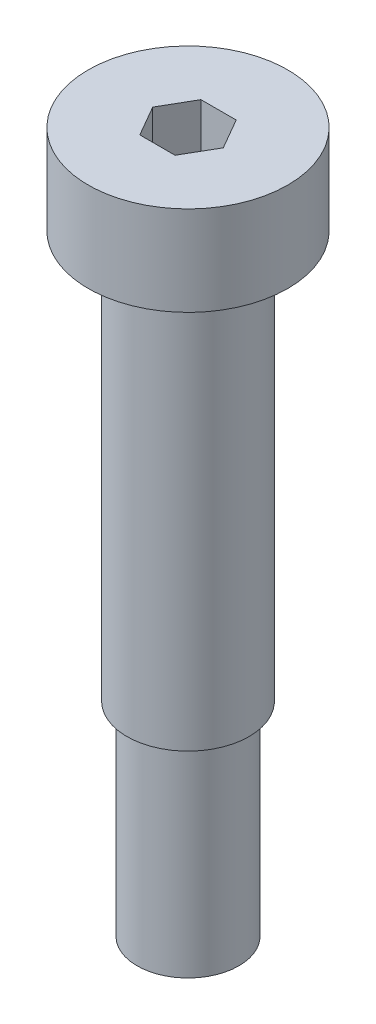
ISO-10303-21;
HEADER;
FILE_DESCRIPTION(('STEP AP214'),'2;1');
FILE_NAME('part.step','',(''),(''),'','','');
FILE_SCHEMA(('AUTOMOTIVE_DESIGN { 1 0 10303 214 1 1 1 1 }'));
ENDSEC;
DATA;
#1=APPLICATION_CONTEXT('core data for automotive mechanical design processes');
#2=APPLICATION_PROTOCOL_DEFINITION('international standard','automotive_design',2000,#1);
#3=PRODUCT_CONTEXT('',#1,'mechanical');
#4=PRODUCT('Part','Part','',(#3));
#5=PRODUCT_RELATED_PRODUCT_CATEGORY('part','',(#4));
#6=PRODUCT_DEFINITION_FORMATION('','',#4);
#7=PRODUCT_DEFINITION_CONTEXT('part definition',#1,'design');
#8=PRODUCT_DEFINITION('design','',#6,#7);
#9=PRODUCT_DEFINITION_SHAPE('','',#8);
#10=(LENGTH_UNIT() NAMED_UNIT(*) SI_UNIT(.MILLI.,.METRE.));
#11=(NAMED_UNIT(*) PLANE_ANGLE_UNIT() SI_UNIT($,.RADIAN.));
#12=(NAMED_UNIT(*) SI_UNIT($,.STERADIAN.) SOLID_ANGLE_UNIT());
#13=UNCERTAINTY_MEASURE_WITH_UNIT(LENGTH_MEASURE(1.E-05),#10,'distance_accuracy_value','');
#14=(GEOMETRIC_REPRESENTATION_CONTEXT(3) GLOBAL_UNCERTAINTY_ASSIGNED_CONTEXT((#13)) GLOBAL_UNIT_ASSIGNED_CONTEXT((#10,
#11,#12)) REPRESENTATION_CONTEXT('',''));
#15=CARTESIAN_POINT('',(0.,0.,0.));
#16=DIRECTION('',(0.,0.,1.));
#17=DIRECTION('',(1.,0.,0.));
#18=AXIS2_PLACEMENT_3D('',#15,#16,#17);
#19=CARTESIAN_POINT('',(2.5,0.,0.));
#20=DIRECTION('',(0.,-1.,0.));
#21=DIRECTION('',(1.,0.,0.));
#22=AXIS2_PLACEMENT_3D('',#19,#20,#21);
#23=PLANE('',#22);
#24=CARTESIAN_POINT('',(0.,0.,0.));
#25=DIRECTION('',(0.,-1.,0.));
#26=DIRECTION('',(1.,0.,0.));
#27=AXIS2_PLACEMENT_3D('',#24,#25,#26);
#28=CIRCLE('',#27,2.5);
#29=CARTESIAN_POINT('',(2.5,0.,0.));
#30=VERTEX_POINT('',#29);
#31=EDGE_CURVE('E157',#30,#30,#28,.T.);
#32=ORIENTED_EDGE('',*,*,#31,.T.);
#33=EDGE_LOOP('',(#32));
#34=FACE_BOUND('',#33,.T.);
#35=ADVANCED_FACE('F43',(#34),#23,.T.);
#36=CARTESIAN_POINT('',(0.,34.4,0.));
#37=DIRECTION('',(0.,1.,0.));
#38=DIRECTION('',(-1.,0.,0.));
#39=AXIS2_PLACEMENT_3D('',#36,#37,#38);
#40=PLANE('',#39);
#41=DIRECTION('',(0.5,0.,-0.866025403784439));
#42=VECTOR('',#41,1.);
#43=CARTESIAN_POINT('',(0.86602540378444,34.4,1.5));
#44=LINE('',#43,#42);
#45=CARTESIAN_POINT('',(0.86602540378444,34.4,1.5));
#46=VERTEX_POINT('',#45);
#47=CARTESIAN_POINT('',(1.73205080756888,34.4,0.));
#48=VERTEX_POINT('',#47);
#49=EDGE_CURVE('E58',#46,#48,#44,.T.);
#50=ORIENTED_EDGE('',*,*,#49,.F.);
#51=DIRECTION('',(1.,0.,0.));
#52=VECTOR('',#51,1.);
#53=CARTESIAN_POINT('',(-0.866025403784439,34.4,1.5));
#54=LINE('',#53,#52);
#55=CARTESIAN_POINT('',(-0.866025403784439,34.4,1.5));
#56=VERTEX_POINT('',#55);
#57=EDGE_CURVE('E151',#56,#46,#54,.T.);
#58=ORIENTED_EDGE('',*,*,#57,.F.);
#59=DIRECTION('',(0.5,0.,0.866025403784438));
#60=VECTOR('',#59,1.);
#61=CARTESIAN_POINT('',(-1.73205080756888,34.4,0.));
#62=LINE('',#61,#60);
#63=CARTESIAN_POINT('',(-1.73205080756888,34.4,0.));
#64=VERTEX_POINT('',#63);
#65=EDGE_CURVE('E148',#64,#56,#62,.T.);
#66=ORIENTED_EDGE('',*,*,#65,.F.);
#67=DIRECTION('',(-0.5,0.,0.866025403784438));
#68=VECTOR('',#67,1.);
#69=CARTESIAN_POINT('',(-0.866025403784439,34.4,-1.5));
#70=LINE('',#69,#68);
#71=CARTESIAN_POINT('',(-0.866025403784439,34.4,-1.5));
#72=VERTEX_POINT('',#71);
#73=EDGE_CURVE('E106',#72,#64,#70,.T.);
#74=ORIENTED_EDGE('',*,*,#73,.F.);
#75=DIRECTION('',(-1.,0.,0.));
#76=VECTOR('',#75,1.);
#77=CARTESIAN_POINT('',(0.866025403784437,34.4,-1.5));
#78=LINE('',#77,#76);
#79=CARTESIAN_POINT('',(0.866025403784437,34.4,-1.5));
#80=VERTEX_POINT('',#79);
#81=EDGE_CURVE('E142',#80,#72,#78,.T.);
#82=ORIENTED_EDGE('',*,*,#81,.F.);
#83=DIRECTION('',(-0.5,0.,-0.866025403784439));
#84=VECTOR('',#83,1.);
#85=CARTESIAN_POINT('',(1.73205080756888,34.4,0.));
#86=LINE('',#85,#84);
#87=EDGE_CURVE('E138',#48,#80,#86,.T.);
#88=ORIENTED_EDGE('',*,*,#87,.F.);
#89=EDGE_LOOP('',(#50,#58,#66,#74,#82,#88));
#90=FACE_BOUND('',#89,.T.);
#91=CARTESIAN_POINT('',(0.,34.4,0.));
#92=DIRECTION('',(0.,-1.,0.));
#93=DIRECTION('',(1.,0.,0.));
#94=AXIS2_PLACEMENT_3D('',#91,#92,#93);
#95=CIRCLE('',#94,4.9);
#96=CARTESIAN_POINT('',(4.9,34.4,0.));
#97=VERTEX_POINT('',#96);
#98=EDGE_CURVE('E11',#97,#97,#95,.T.);
#99=ORIENTED_EDGE('',*,*,#98,.F.);
#100=EDGE_LOOP('',(#99));
#101=FACE_BOUND('',#100,.T.);
#102=ADVANCED_FACE('F190',(#90,#101),#40,.T.);
#103=CARTESIAN_POINT('',(0.,0.,0.));
#104=DIRECTION('',(0.,-1.,0.));
#105=DIRECTION('',(1.,0.,0.));
#106=AXIS2_PLACEMENT_3D('',#103,#104,#105);
#107=CYLINDRICAL_SURFACE('',#106,4.9);
#108=ORIENTED_EDGE('',*,*,#98,.T.);
#109=EDGE_LOOP('',(#108));
#110=FACE_BOUND('',#109,.T.);
#111=CARTESIAN_POINT('',(0.,30.,0.));
#112=DIRECTION('',(0.,-1.,0.));
#113=DIRECTION('',(1.,0.,0.));
#114=AXIS2_PLACEMENT_3D('',#111,#112,#113);
#115=CIRCLE('',#114,4.9);
#116=CARTESIAN_POINT('',(4.9,30.,0.));
#117=VERTEX_POINT('',#116);
#118=EDGE_CURVE('E51',#117,#117,#115,.T.);
#119=ORIENTED_EDGE('',*,*,#118,.F.);
#120=EDGE_LOOP('',(#119));
#121=FACE_BOUND('',#120,.T.);
#122=ADVANCED_FACE('F188',(#110,#121),#107,.T.);
#123=CARTESIAN_POINT('',(4.9,30.,0.));
#124=DIRECTION('',(0.,-1.,0.));
#125=DIRECTION('',(1.,0.,0.));
#126=AXIS2_PLACEMENT_3D('',#123,#124,#125);
#127=PLANE('',#126);
#128=ORIENTED_EDGE('',*,*,#118,.T.);
#129=EDGE_LOOP('',(#128));
#130=FACE_BOUND('',#129,.T.);
#131=CARTESIAN_POINT('',(0.,30.,0.));
#132=DIRECTION('',(0.,-1.,0.));
#133=DIRECTION('',(1.,0.,0.));
#134=AXIS2_PLACEMENT_3D('',#131,#132,#133);
#135=CIRCLE('',#134,3.);
#136=CARTESIAN_POINT('',(3.,30.,0.));
#137=VERTEX_POINT('',#136);
#138=EDGE_CURVE('E178',#137,#137,#135,.T.);
#139=ORIENTED_EDGE('',*,*,#138,.F.);
#140=EDGE_LOOP('',(#139));
#141=FACE_BOUND('',#140,.T.);
#142=ADVANCED_FACE('F185',(#130,#141),#127,.T.);
#143=CARTESIAN_POINT('',(0.,0.,0.));
#144=DIRECTION('',(0.,-1.,0.));
#145=DIRECTION('',(1.,0.,0.));
#146=AXIS2_PLACEMENT_3D('',#143,#144,#145);
#147=CYLINDRICAL_SURFACE('',#146,3.);
#148=ORIENTED_EDGE('',*,*,#138,.T.);
#149=EDGE_LOOP('',(#148));
#150=FACE_BOUND('',#149,.T.);
#151=CARTESIAN_POINT('',(0.,10.,0.));
#152=DIRECTION('',(0.,-1.,0.));
#153=DIRECTION('',(1.,0.,0.));
#154=AXIS2_PLACEMENT_3D('',#151,#152,#153);
#155=CIRCLE('',#154,3.);
#156=CARTESIAN_POINT('',(3.,10.,0.));
#157=VERTEX_POINT('',#156);
#158=EDGE_CURVE('E174',#157,#157,#155,.T.);
#159=ORIENTED_EDGE('',*,*,#158,.F.);
#160=EDGE_LOOP('',(#159));
#161=FACE_BOUND('',#160,.T.);
#162=ADVANCED_FACE('F197',(#150,#161),#147,.T.);
#163=CARTESIAN_POINT('',(3.,10.,0.));
#164=DIRECTION('',(0.,-1.,0.));
#165=DIRECTION('',(1.,0.,0.));
#166=AXIS2_PLACEMENT_3D('',#163,#164,#165);
#167=PLANE('',#166);
#168=ORIENTED_EDGE('',*,*,#158,.T.);
#169=EDGE_LOOP('',(#168));
#170=FACE_BOUND('',#169,.T.);
#171=CARTESIAN_POINT('',(0.,10.,0.));
#172=DIRECTION('',(0.,-1.,0.));
#173=DIRECTION('',(1.,0.,0.));
#174=AXIS2_PLACEMENT_3D('',#171,#172,#173);
#175=CIRCLE('',#174,2.5);
#176=CARTESIAN_POINT('',(2.5,10.,0.));
#177=VERTEX_POINT('',#176);
#178=EDGE_CURVE('E170',#177,#177,#175,.T.);
#179=ORIENTED_EDGE('',*,*,#178,.F.);
#180=EDGE_LOOP('',(#179));
#181=FACE_BOUND('',#180,.T.);
#182=ADVANCED_FACE('F209',(#170,#181),#167,.T.);
#183=CARTESIAN_POINT('',(0.,0.,0.));
#184=DIRECTION('',(0.,-1.,0.));
#185=DIRECTION('',(1.,0.,0.));
#186=AXIS2_PLACEMENT_3D('',#183,#184,#185);
#187=CYLINDRICAL_SURFACE('',#186,2.5);
#188=ORIENTED_EDGE('',*,*,#178,.T.);
#189=EDGE_LOOP('',(#188));
#190=FACE_BOUND('',#189,.T.);
#191=ORIENTED_EDGE('',*,*,#31,.F.);
#192=EDGE_LOOP('',(#191));
#193=FACE_BOUND('',#192,.T.);
#194=ADVANCED_FACE('F206',(#190,#193),#187,.T.);
#195=CARTESIAN_POINT('',(0.86602540378444,31.4,1.5));
#196=DIRECTION('',(0.866025403784439,0.,0.5));
#197=DIRECTION('',(0.5,0.,-0.866025403784439));
#198=AXIS2_PLACEMENT_3D('',#195,#196,#197);
#199=PLANE('',#198);
#200=ORIENTED_EDGE('',*,*,#49,.T.);
#201=DIRECTION('',(0.,1.,0.));
#202=VECTOR('',#201,1.);
#203=CARTESIAN_POINT('',(1.73205080756888,31.4,0.));
#204=LINE('',#203,#202);
#205=CARTESIAN_POINT('',(1.73205080756888,31.4,0.));
#206=VERTEX_POINT('',#205);
#207=EDGE_CURVE('E88',#206,#48,#204,.T.);
#208=ORIENTED_EDGE('',*,*,#207,.F.);
#209=DIRECTION('',(0.5,0.,-0.866025403784439));
#210=VECTOR('',#209,1.);
#211=CARTESIAN_POINT('',(0.86602540378444,31.4,1.5));
#212=LINE('',#211,#210);
#213=CARTESIAN_POINT('',(0.86602540378444,31.4,1.5));
#214=VERTEX_POINT('',#213);
#215=EDGE_CURVE('E154',#214,#206,#212,.T.);
#216=ORIENTED_EDGE('',*,*,#215,.F.);
#217=DIRECTION('',(0.,1.,0.));
#218=VECTOR('',#217,1.);
#219=CARTESIAN_POINT('',(0.86602540378444,31.4,1.5));
#220=LINE('',#219,#218);
#221=EDGE_CURVE('E66',#214,#46,#220,.T.);
#222=ORIENTED_EDGE('',*,*,#221,.T.);
#223=EDGE_LOOP('',(#200,#208,#216,#222));
#224=FACE_BOUND('',#223,.T.);
#225=ADVANCED_FACE('F208',(#224),#199,.F.);
#226=CARTESIAN_POINT('',(-0.866025403784439,31.4,1.5));
#227=DIRECTION('',(0.,0.,1.));
#228=DIRECTION('',(1.,0.,0.));
#229=AXIS2_PLACEMENT_3D('',#226,#227,#228);
#230=PLANE('',#229);
#231=ORIENTED_EDGE('',*,*,#57,.T.);
#232=ORIENTED_EDGE('',*,*,#221,.F.);
#233=DIRECTION('',(1.,0.,0.));
#234=VECTOR('',#233,1.);
#235=CARTESIAN_POINT('',(-0.866025403784439,31.4,1.5));
#236=LINE('',#235,#234);
#237=CARTESIAN_POINT('',(-0.866025403784439,31.4,1.5));
#238=VERTEX_POINT('',#237);
#239=EDGE_CURVE('E120',#238,#214,#236,.T.);
#240=ORIENTED_EDGE('',*,*,#239,.F.);
#241=DIRECTION('',(0.,1.,0.));
#242=VECTOR('',#241,1.);
#243=CARTESIAN_POINT('',(-0.866025403784439,31.4,1.5));
#244=LINE('',#243,#242);
#245=EDGE_CURVE('E111',#238,#56,#244,.T.);
#246=ORIENTED_EDGE('',*,*,#245,.T.);
#247=EDGE_LOOP('',(#231,#232,#240,#246));
#248=FACE_BOUND('',#247,.T.);
#249=ADVANCED_FACE('F216',(#248),#230,.F.);
#250=CARTESIAN_POINT('',(-1.73205080756888,31.4,0.));
#251=DIRECTION('',(-0.866025403784438,0.,0.500000000000001));
#252=DIRECTION('',(0.500000000000001,0.,0.866025403784438));
#253=AXIS2_PLACEMENT_3D('',#250,#251,#252);
#254=PLANE('',#253);
#255=ORIENTED_EDGE('',*,*,#65,.T.);
#256=ORIENTED_EDGE('',*,*,#245,.F.);
#257=DIRECTION('',(0.5,0.,0.866025403784438));
#258=VECTOR('',#257,1.);
#259=CARTESIAN_POINT('',(-1.73205080756888,31.4,0.));
#260=LINE('',#259,#258);
#261=CARTESIAN_POINT('',(-1.73205080756888,31.4,0.));
#262=VERTEX_POINT('',#261);
#263=EDGE_CURVE('E115',#262,#238,#260,.T.);
#264=ORIENTED_EDGE('',*,*,#263,.F.);
#265=DIRECTION('',(0.,1.,0.));
#266=VECTOR('',#265,1.);
#267=CARTESIAN_POINT('',(-1.73205080756888,31.4,0.));
#268=LINE('',#267,#266);
#269=EDGE_CURVE('E99',#262,#64,#268,.T.);
#270=ORIENTED_EDGE('',*,*,#269,.T.);
#271=EDGE_LOOP('',(#255,#256,#264,#270));
#272=FACE_BOUND('',#271,.T.);
#273=ADVANCED_FACE('F116',(#272),#254,.F.);
#274=CARTESIAN_POINT('',(-0.866025403784439,31.4,-1.5));
#275=DIRECTION('',(-0.866025403784439,0.,-0.5));
#276=DIRECTION('',(-0.5,0.,0.866025403784439));
#277=AXIS2_PLACEMENT_3D('',#274,#275,#276);
#278=PLANE('',#277);
#279=ORIENTED_EDGE('',*,*,#73,.T.);
#280=ORIENTED_EDGE('',*,*,#269,.F.);
#281=DIRECTION('',(-0.5,0.,0.866025403784438));
#282=VECTOR('',#281,1.);
#283=CARTESIAN_POINT('',(-0.866025403784439,31.4,-1.5));
#284=LINE('',#283,#282);
#285=CARTESIAN_POINT('',(-0.866025403784439,31.4,-1.5));
#286=VERTEX_POINT('',#285);
#287=EDGE_CURVE('E103',#286,#262,#284,.T.);
#288=ORIENTED_EDGE('',*,*,#287,.F.);
#289=DIRECTION('',(0.,1.,0.));
#290=VECTOR('',#289,1.);
#291=CARTESIAN_POINT('',(-0.866025403784439,31.4,-1.5));
#292=LINE('',#291,#290);
#293=EDGE_CURVE('E112',#286,#72,#292,.T.);
#294=ORIENTED_EDGE('',*,*,#293,.T.);
#295=EDGE_LOOP('',(#279,#280,#288,#294));
#296=FACE_BOUND('',#295,.T.);
#297=ADVANCED_FACE('F101',(#296),#278,.F.);
#298=CARTESIAN_POINT('',(0.866025403784437,31.4,-1.5));
#299=DIRECTION('',(0.,0.,-1.));
#300=DIRECTION('',(-1.,0.,0.));
#301=AXIS2_PLACEMENT_3D('',#298,#299,#300);
#302=PLANE('',#301);
#303=ORIENTED_EDGE('',*,*,#81,.T.);
#304=ORIENTED_EDGE('',*,*,#293,.F.);
#305=DIRECTION('',(-1.,0.,0.));
#306=VECTOR('',#305,1.);
#307=CARTESIAN_POINT('',(0.866025403784437,31.4,-1.5));
#308=LINE('',#307,#306);
#309=CARTESIAN_POINT('',(0.866025403784437,31.4,-1.5));
#310=VERTEX_POINT('',#309);
#311=EDGE_CURVE('E126',#310,#286,#308,.T.);
#312=ORIENTED_EDGE('',*,*,#311,.F.);
#313=DIRECTION('',(0.,1.,0.));
#314=VECTOR('',#313,1.);
#315=CARTESIAN_POINT('',(0.866025403784437,31.4,-1.5));
#316=LINE('',#315,#314);
#317=EDGE_CURVE('E162',#310,#80,#316,.T.);
#318=ORIENTED_EDGE('',*,*,#317,.T.);
#319=EDGE_LOOP('',(#303,#304,#312,#318));
#320=FACE_BOUND('',#319,.T.);
#321=ADVANCED_FACE('F292',(#320),#302,.F.);
#322=CARTESIAN_POINT('',(1.73205080756888,31.4,0.));
#323=DIRECTION('',(0.866025403784438,0.,-0.5));
#324=DIRECTION('',(-0.5,0.,-0.866025403784439));
#325=AXIS2_PLACEMENT_3D('',#322,#323,#324);
#326=PLANE('',#325);
#327=ORIENTED_EDGE('',*,*,#87,.T.);
#328=ORIENTED_EDGE('',*,*,#317,.F.);
#329=DIRECTION('',(-0.5,0.,-0.866025403784439));
#330=VECTOR('',#329,1.);
#331=CARTESIAN_POINT('',(1.73205080756888,31.4,0.));
#332=LINE('',#331,#330);
#333=EDGE_CURVE('E130',#206,#310,#332,.T.);
#334=ORIENTED_EDGE('',*,*,#333,.F.);
#335=ORIENTED_EDGE('',*,*,#207,.T.);
#336=EDGE_LOOP('',(#327,#328,#334,#335));
#337=FACE_BOUND('',#336,.T.);
#338=ADVANCED_FACE('F302',(#337),#326,.F.);
#339=CARTESIAN_POINT('',(0.,31.4,0.));
#340=DIRECTION('',(0.,1.,0.));
#341=DIRECTION('',(0.,0.,1.));
#342=AXIS2_PLACEMENT_3D('',#339,#340,#341);
#343=PLANE('',#342);
#344=ORIENTED_EDGE('',*,*,#215,.T.);
#345=ORIENTED_EDGE('',*,*,#333,.T.);
#346=ORIENTED_EDGE('',*,*,#311,.T.);
#347=ORIENTED_EDGE('',*,*,#287,.T.);
#348=ORIENTED_EDGE('',*,*,#263,.T.);
#349=ORIENTED_EDGE('',*,*,#239,.T.);
#350=EDGE_LOOP('',(#344,#345,#346,#347,#348,#349));
#351=FACE_BOUND('',#350,.T.);
#352=ADVANCED_FACE('F123',(#351),#343,.T.);
#353=CLOSED_SHELL('',(#35,#102,#122,#142,#162,#182,#194,#225,#249,#273,#297,#321,#338,#352));
#354=MANIFOLD_SOLID_BREP('B2',#353);
#355=ADVANCED_BREP_SHAPE_REPRESENTATION('',(#18,#354),#14);
#356=SHAPE_DEFINITION_REPRESENTATION(#9,#355);
ENDSEC;
END-ISO-10303-21;
